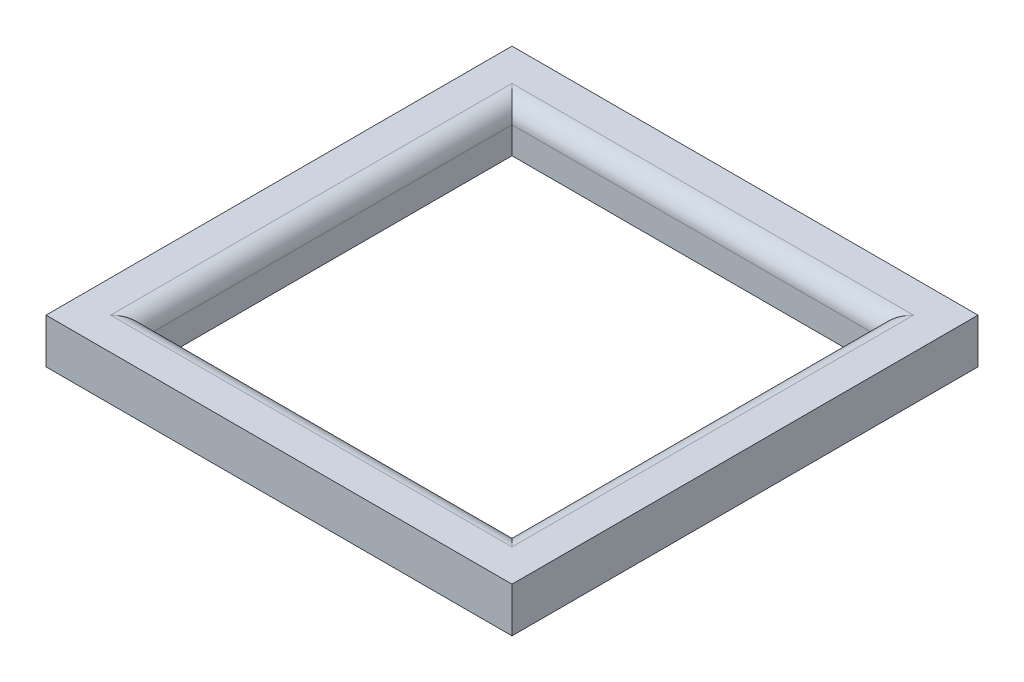
ISO-10303-21;
HEADER;
FILE_DESCRIPTION(('STEP AP214'),'2;1');
FILE_NAME('part.step','',(''),(''),'','','');
FILE_SCHEMA(('AUTOMOTIVE_DESIGN { 1 0 10303 214 1 1 1 1 }'));
ENDSEC;
DATA;
#1=APPLICATION_CONTEXT('core data for automotive mechanical design processes');
#2=APPLICATION_PROTOCOL_DEFINITION('international standard','automotive_design',2000,#1);
#3=PRODUCT_CONTEXT('',#1,'mechanical');
#4=PRODUCT('Part','Part','',(#3));
#5=PRODUCT_RELATED_PRODUCT_CATEGORY('part','',(#4));
#6=PRODUCT_DEFINITION_FORMATION('','',#4);
#7=PRODUCT_DEFINITION_CONTEXT('part definition',#1,'design');
#8=PRODUCT_DEFINITION('design','',#6,#7);
#9=PRODUCT_DEFINITION_SHAPE('','',#8);
#10=(LENGTH_UNIT() NAMED_UNIT(*) SI_UNIT(.MILLI.,.METRE.));
#11=(NAMED_UNIT(*) PLANE_ANGLE_UNIT() SI_UNIT($,.RADIAN.));
#12=(NAMED_UNIT(*) SI_UNIT($,.STERADIAN.) SOLID_ANGLE_UNIT());
#13=UNCERTAINTY_MEASURE_WITH_UNIT(LENGTH_MEASURE(1.E-05),#10,'distance_accuracy_value','');
#14=(GEOMETRIC_REPRESENTATION_CONTEXT(3) GLOBAL_UNCERTAINTY_ASSIGNED_CONTEXT((#13)) GLOBAL_UNIT_ASSIGNED_CONTEXT((#10,
#11,#12)) REPRESENTATION_CONTEXT('',''));
#15=CARTESIAN_POINT('',(0.,0.,0.));
#16=DIRECTION('',(0.,0.,1.));
#17=DIRECTION('',(1.,0.,0.));
#18=AXIS2_PLACEMENT_3D('',#15,#16,#17);
#19=CARTESIAN_POINT('',(0.,2.5,0.));
#20=DIRECTION('',(0.,1.,0.));
#21=DIRECTION('',(0.,0.,1.));
#22=AXIS2_PLACEMENT_3D('',#19,#20,#21);
#23=PLANE('',#22);
#24=DIRECTION('',(0.,0.,-1.));
#25=VECTOR('',#24,1.);
#26=CARTESIAN_POINT('',(11.2,2.5,0.));
#27=LINE('',#26,#25);
#28=CARTESIAN_POINT('',(11.2,2.5,-11.2));
#29=VERTEX_POINT('',#28);
#30=CARTESIAN_POINT('',(11.2,2.5,11.2));
#31=VERTEX_POINT('',#30);
#32=EDGE_CURVE('E176',#29,#31,#27,.F.);
#33=ORIENTED_EDGE('',*,*,#32,.T.);
#34=DIRECTION('',(1.,0.,0.));
#35=VECTOR('',#34,1.);
#36=CARTESIAN_POINT('',(0.,2.5,11.2));
#37=LINE('',#36,#35);
#38=CARTESIAN_POINT('',(-11.2,2.5,11.2));
#39=VERTEX_POINT('',#38);
#40=EDGE_CURVE('E178',#31,#39,#37,.F.);
#41=ORIENTED_EDGE('',*,*,#40,.T.);
#42=DIRECTION('',(0.,0.,1.));
#43=VECTOR('',#42,1.);
#44=CARTESIAN_POINT('',(-11.2,2.5,0.));
#45=LINE('',#44,#43);
#46=CARTESIAN_POINT('',(-11.2,2.5,-11.2));
#47=VERTEX_POINT('',#46);
#48=EDGE_CURVE('E172',#39,#47,#45,.F.);
#49=ORIENTED_EDGE('',*,*,#48,.T.);
#50=DIRECTION('',(-1.,0.,0.));
#51=VECTOR('',#50,1.);
#52=CARTESIAN_POINT('',(0.,2.5,-11.2));
#53=LINE('',#52,#51);
#54=EDGE_CURVE('E174',#47,#29,#53,.F.);
#55=ORIENTED_EDGE('',*,*,#54,.T.);
#56=EDGE_LOOP('',(#33,#41,#49,#55));
#57=FACE_BOUND('',#56,.T.);
#58=DIRECTION('',(0.,0.,-1.));
#59=VECTOR('',#58,1.);
#60=CARTESIAN_POINT('',(13.,2.5,-13.));
#61=LINE('',#60,#59);
#62=CARTESIAN_POINT('',(13.,2.5,13.));
#63=VERTEX_POINT('',#62);
#64=CARTESIAN_POINT('',(13.,2.5,-13.));
#65=VERTEX_POINT('',#64);
#66=EDGE_CURVE('E140',#63,#65,#61,.T.);
#67=ORIENTED_EDGE('',*,*,#66,.T.);
#68=DIRECTION('',(-1.,0.,0.));
#69=VECTOR('',#68,1.);
#70=CARTESIAN_POINT('',(-13.,2.5,-13.));
#71=LINE('',#70,#69);
#72=CARTESIAN_POINT('',(-13.,2.5,-13.));
#73=VERTEX_POINT('',#72);
#74=EDGE_CURVE('E143',#65,#73,#71,.T.);
#75=ORIENTED_EDGE('',*,*,#74,.T.);
#76=DIRECTION('',(0.,0.,1.));
#77=VECTOR('',#76,1.);
#78=CARTESIAN_POINT('',(-13.,2.5,-13.));
#79=LINE('',#78,#77);
#80=CARTESIAN_POINT('',(-13.,2.5,13.));
#81=VERTEX_POINT('',#80);
#82=EDGE_CURVE('E146',#73,#81,#79,.T.);
#83=ORIENTED_EDGE('',*,*,#82,.T.);
#84=DIRECTION('',(1.,0.,0.));
#85=VECTOR('',#84,1.);
#86=CARTESIAN_POINT('',(-13.,2.5,13.));
#87=LINE('',#86,#85);
#88=EDGE_CURVE('E148',#81,#63,#87,.T.);
#89=ORIENTED_EDGE('',*,*,#88,.T.);
#90=EDGE_LOOP('',(#67,#75,#83,#89));
#91=FACE_BOUND('',#90,.T.);
#92=ADVANCED_FACE('F33',(#57,#91),#23,.T.);
#93=CARTESIAN_POINT('',(0.,0.,0.));
#94=DIRECTION('',(0.,1.,0.));
#95=DIRECTION('',(0.,0.,1.));
#96=AXIS2_PLACEMENT_3D('',#93,#94,#95);
#97=PLANE('',#96);
#98=DIRECTION('',(0.,0.,-1.));
#99=VECTOR('',#98,1.);
#100=CARTESIAN_POINT('',(13.,0.,-13.));
#101=LINE('',#100,#99);
#102=CARTESIAN_POINT('',(13.,0.,13.));
#103=VERTEX_POINT('',#102);
#104=CARTESIAN_POINT('',(13.,0.,-13.));
#105=VERTEX_POINT('',#104);
#106=EDGE_CURVE('E115',#103,#105,#101,.T.);
#107=ORIENTED_EDGE('',*,*,#106,.F.);
#108=DIRECTION('',(1.,0.,0.));
#109=VECTOR('',#108,1.);
#110=CARTESIAN_POINT('',(-13.,0.,13.));
#111=LINE('',#110,#109);
#112=CARTESIAN_POINT('',(-13.,0.,13.));
#113=VERTEX_POINT('',#112);
#114=EDGE_CURVE('E144',#113,#103,#111,.T.);
#115=ORIENTED_EDGE('',*,*,#114,.F.);
#116=DIRECTION('',(0.,0.,1.));
#117=VECTOR('',#116,1.);
#118=CARTESIAN_POINT('',(-13.,0.,-13.));
#119=LINE('',#118,#117);
#120=CARTESIAN_POINT('',(-13.,0.,-13.));
#121=VERTEX_POINT('',#120);
#122=EDGE_CURVE('E155',#121,#113,#119,.T.);
#123=ORIENTED_EDGE('',*,*,#122,.F.);
#124=DIRECTION('',(-1.,0.,0.));
#125=VECTOR('',#124,1.);
#126=CARTESIAN_POINT('',(-13.,0.,-13.));
#127=LINE('',#126,#125);
#128=EDGE_CURVE('E153',#105,#121,#127,.T.);
#129=ORIENTED_EDGE('',*,*,#128,.F.);
#130=EDGE_LOOP('',(#107,#115,#123,#129));
#131=FACE_BOUND('',#130,.T.);
#132=DIRECTION('',(0.,0.,-1.));
#133=VECTOR('',#132,1.);
#134=CARTESIAN_POINT('',(10.2,0.,-10.2));
#135=LINE('',#134,#133);
#136=CARTESIAN_POINT('',(10.2,0.,10.2));
#137=VERTEX_POINT('',#136);
#138=CARTESIAN_POINT('',(10.2,0.,-10.2));
#139=VERTEX_POINT('',#138);
#140=EDGE_CURVE('E113',#137,#139,#135,.T.);
#141=ORIENTED_EDGE('',*,*,#140,.T.);
#142=DIRECTION('',(-1.,0.,0.));
#143=VECTOR('',#142,1.);
#144=CARTESIAN_POINT('',(-10.2,0.,-10.2));
#145=LINE('',#144,#143);
#146=CARTESIAN_POINT('',(-10.2,0.,-10.2));
#147=VERTEX_POINT('',#146);
#148=EDGE_CURVE('E119',#139,#147,#145,.T.);
#149=ORIENTED_EDGE('',*,*,#148,.T.);
#150=DIRECTION('',(0.,0.,1.));
#151=VECTOR('',#150,1.);
#152=CARTESIAN_POINT('',(-10.2,0.,-10.2));
#153=LINE('',#152,#151);
#154=CARTESIAN_POINT('',(-10.2,0.,10.2));
#155=VERTEX_POINT('',#154);
#156=EDGE_CURVE('E124',#147,#155,#153,.T.);
#157=ORIENTED_EDGE('',*,*,#156,.T.);
#158=DIRECTION('',(1.,0.,0.));
#159=VECTOR('',#158,1.);
#160=CARTESIAN_POINT('',(-10.2,0.,10.2));
#161=LINE('',#160,#159);
#162=EDGE_CURVE('E128',#155,#137,#161,.T.);
#163=ORIENTED_EDGE('',*,*,#162,.T.);
#164=EDGE_LOOP('',(#141,#149,#157,#163));
#165=FACE_BOUND('',#164,.T.);
#166=ADVANCED_FACE('F126',(#131,#165),#97,.F.);
#167=CARTESIAN_POINT('',(13.,2.5,-13.));
#168=DIRECTION('',(-1.,0.,0.));
#169=DIRECTION('',(0.,0.,1.));
#170=AXIS2_PLACEMENT_3D('',#167,#168,#169);
#171=PLANE('',#170);
#172=ORIENTED_EDGE('',*,*,#106,.T.);
#173=DIRECTION('',(0.,-1.,0.));
#174=VECTOR('',#173,1.);
#175=CARTESIAN_POINT('',(13.,2.5,-13.));
#176=LINE('',#175,#174);
#177=EDGE_CURVE('E166',#65,#105,#176,.T.);
#178=ORIENTED_EDGE('',*,*,#177,.F.);
#179=ORIENTED_EDGE('',*,*,#66,.F.);
#180=DIRECTION('',(0.,-1.,0.));
#181=VECTOR('',#180,1.);
#182=CARTESIAN_POINT('',(13.,2.5,13.));
#183=LINE('',#182,#181);
#184=EDGE_CURVE('E150',#63,#103,#183,.T.);
#185=ORIENTED_EDGE('',*,*,#184,.T.);
#186=EDGE_LOOP('',(#172,#178,#179,#185));
#187=FACE_BOUND('',#186,.T.);
#188=ADVANCED_FACE('F219',(#187),#171,.F.);
#189=CARTESIAN_POINT('',(-13.,2.5,-13.));
#190=DIRECTION('',(0.,0.,1.));
#191=DIRECTION('',(1.,0.,0.));
#192=AXIS2_PLACEMENT_3D('',#189,#190,#191);
#193=PLANE('',#192);
#194=ORIENTED_EDGE('',*,*,#128,.T.);
#195=DIRECTION('',(0.,-1.,0.));
#196=VECTOR('',#195,1.);
#197=CARTESIAN_POINT('',(-13.,2.5,-13.));
#198=LINE('',#197,#196);
#199=EDGE_CURVE('E163',#73,#121,#198,.T.);
#200=ORIENTED_EDGE('',*,*,#199,.F.);
#201=ORIENTED_EDGE('',*,*,#74,.F.);
#202=ORIENTED_EDGE('',*,*,#177,.T.);
#203=EDGE_LOOP('',(#194,#200,#201,#202));
#204=FACE_BOUND('',#203,.T.);
#205=ADVANCED_FACE('F222',(#204),#193,.F.);
#206=CARTESIAN_POINT('',(-13.,2.5,-13.));
#207=DIRECTION('',(1.,0.,0.));
#208=DIRECTION('',(0.,0.,-1.));
#209=AXIS2_PLACEMENT_3D('',#206,#207,#208);
#210=PLANE('',#209);
#211=ORIENTED_EDGE('',*,*,#122,.T.);
#212=DIRECTION('',(0.,-1.,0.));
#213=VECTOR('',#212,1.);
#214=CARTESIAN_POINT('',(-13.,2.5,13.));
#215=LINE('',#214,#213);
#216=EDGE_CURVE('E160',#81,#113,#215,.T.);
#217=ORIENTED_EDGE('',*,*,#216,.F.);
#218=ORIENTED_EDGE('',*,*,#82,.F.);
#219=ORIENTED_EDGE('',*,*,#199,.T.);
#220=EDGE_LOOP('',(#211,#217,#218,#219));
#221=FACE_BOUND('',#220,.T.);
#222=ADVANCED_FACE('F227',(#221),#210,.F.);
#223=CARTESIAN_POINT('',(-13.,2.5,13.));
#224=DIRECTION('',(0.,0.,-1.));
#225=DIRECTION('',(-1.,0.,0.));
#226=AXIS2_PLACEMENT_3D('',#223,#224,#225);
#227=PLANE('',#226);
#228=ORIENTED_EDGE('',*,*,#114,.T.);
#229=ORIENTED_EDGE('',*,*,#184,.F.);
#230=ORIENTED_EDGE('',*,*,#88,.F.);
#231=ORIENTED_EDGE('',*,*,#216,.T.);
#232=EDGE_LOOP('',(#228,#229,#230,#231));
#233=FACE_BOUND('',#232,.T.);
#234=ADVANCED_FACE('F230',(#233),#227,.F.);
#235=CARTESIAN_POINT('',(10.2,2.5,-10.2));
#236=DIRECTION('',(-1.,0.,0.));
#237=DIRECTION('',(0.,0.,1.));
#238=AXIS2_PLACEMENT_3D('',#235,#236,#237);
#239=PLANE('',#238);
#240=DIRECTION('',(0.,-1.,0.));
#241=VECTOR('',#240,1.);
#242=CARTESIAN_POINT('',(10.2,2.5,10.2));
#243=LINE('',#242,#241);
#244=CARTESIAN_POINT('',(10.2,1.5,10.2));
#245=VERTEX_POINT('',#244);
#246=EDGE_CURVE('E135',#245,#137,#243,.T.);
#247=ORIENTED_EDGE('',*,*,#246,.F.);
#248=DIRECTION('',(0.,0.,-1.));
#249=VECTOR('',#248,1.);
#250=CARTESIAN_POINT('',(10.2,1.5,-10.2));
#251=LINE('',#250,#249);
#252=CARTESIAN_POINT('',(10.2,1.5,-10.2));
#253=VERTEX_POINT('',#252);
#254=EDGE_CURVE('E57',#245,#253,#251,.T.);
#255=ORIENTED_EDGE('',*,*,#254,.T.);
#256=DIRECTION('',(0.,-1.,0.));
#257=VECTOR('',#256,1.);
#258=CARTESIAN_POINT('',(10.2,2.5,-10.2));
#259=LINE('',#258,#257);
#260=EDGE_CURVE('E109',#253,#139,#259,.T.);
#261=ORIENTED_EDGE('',*,*,#260,.T.);
#262=ORIENTED_EDGE('',*,*,#140,.F.);
#263=EDGE_LOOP('',(#247,#255,#261,#262));
#264=FACE_BOUND('',#263,.T.);
#265=ADVANCED_FACE('F111',(#264),#239,.T.);
#266=CARTESIAN_POINT('',(-10.2,2.5,-10.2));
#267=DIRECTION('',(0.,0.,1.));
#268=DIRECTION('',(1.,0.,0.));
#269=AXIS2_PLACEMENT_3D('',#266,#267,#268);
#270=PLANE('',#269);
#271=ORIENTED_EDGE('',*,*,#260,.F.);
#272=DIRECTION('',(-1.,0.,0.));
#273=VECTOR('',#272,1.);
#274=CARTESIAN_POINT('',(-10.2,1.5,-10.2));
#275=LINE('',#274,#273);
#276=CARTESIAN_POINT('',(-10.2,1.5,-10.2));
#277=VERTEX_POINT('',#276);
#278=EDGE_CURVE('E42',#253,#277,#275,.T.);
#279=ORIENTED_EDGE('',*,*,#278,.T.);
#280=DIRECTION('',(0.,-1.,0.));
#281=VECTOR('',#280,1.);
#282=CARTESIAN_POINT('',(-10.2,2.5,-10.2));
#283=LINE('',#282,#281);
#284=EDGE_CURVE('E116',#277,#147,#283,.T.);
#285=ORIENTED_EDGE('',*,*,#284,.T.);
#286=ORIENTED_EDGE('',*,*,#148,.F.);
#287=EDGE_LOOP('',(#271,#279,#285,#286));
#288=FACE_BOUND('',#287,.T.);
#289=ADVANCED_FACE('F120',(#288),#270,.T.);
#290=CARTESIAN_POINT('',(-10.2,2.5,-10.2));
#291=DIRECTION('',(1.,0.,0.));
#292=DIRECTION('',(0.,0.,-1.));
#293=AXIS2_PLACEMENT_3D('',#290,#291,#292);
#294=PLANE('',#293);
#295=ORIENTED_EDGE('',*,*,#284,.F.);
#296=DIRECTION('',(0.,0.,1.));
#297=VECTOR('',#296,1.);
#298=CARTESIAN_POINT('',(-10.2,1.5,-10.2));
#299=LINE('',#298,#297);
#300=CARTESIAN_POINT('',(-10.2,1.5,10.2));
#301=VERTEX_POINT('',#300);
#302=EDGE_CURVE('E11',#277,#301,#299,.T.);
#303=ORIENTED_EDGE('',*,*,#302,.T.);
#304=DIRECTION('',(0.,-1.,0.));
#305=VECTOR('',#304,1.);
#306=CARTESIAN_POINT('',(-10.2,2.5,10.2));
#307=LINE('',#306,#305);
#308=EDGE_CURVE('E137',#301,#155,#307,.T.);
#309=ORIENTED_EDGE('',*,*,#308,.T.);
#310=ORIENTED_EDGE('',*,*,#156,.F.);
#311=EDGE_LOOP('',(#295,#303,#309,#310));
#312=FACE_BOUND('',#311,.T.);
#313=ADVANCED_FACE('F203',(#312),#294,.T.);
#314=CARTESIAN_POINT('',(-10.2,2.5,10.2));
#315=DIRECTION('',(0.,0.,-1.));
#316=DIRECTION('',(-1.,0.,0.));
#317=AXIS2_PLACEMENT_3D('',#314,#315,#316);
#318=PLANE('',#317);
#319=ORIENTED_EDGE('',*,*,#308,.F.);
#320=DIRECTION('',(1.,0.,0.));
#321=VECTOR('',#320,1.);
#322=CARTESIAN_POINT('',(-10.2,1.5,10.2));
#323=LINE('',#322,#321);
#324=EDGE_CURVE('E169',#301,#245,#323,.T.);
#325=ORIENTED_EDGE('',*,*,#324,.T.);
#326=ORIENTED_EDGE('',*,*,#246,.T.);
#327=ORIENTED_EDGE('',*,*,#162,.F.);
#328=EDGE_LOOP('',(#319,#325,#326,#327));
#329=FACE_BOUND('',#328,.T.);
#330=ADVANCED_FACE('F205',(#329),#318,.T.);
#331=CARTESIAN_POINT('',(-10.2,1.5,-11.2));
#332=DIRECTION('',(-1.,0.,0.));
#333=DIRECTION('',(0.,0.,1.));
#334=AXIS2_PLACEMENT_3D('',#331,#332,#333);
#335=CYLINDRICAL_SURFACE('',#334,1.);
#336=CARTESIAN_POINT('',(11.2,1.5,-11.2));
#337=DIRECTION('',(-0.707106781186547,0.,-0.707106781186547));
#338=DIRECTION('',(0.707106781186547,0.,-0.707106781186547));
#339=AXIS2_PLACEMENT_3D('',#336,#337,#338);
#340=ELLIPSE('',#339,1.41421356237309,1.);
#341=EDGE_CURVE('E131',#29,#253,#340,.F.);
#342=ORIENTED_EDGE('',*,*,#341,.F.);
#343=ORIENTED_EDGE('',*,*,#54,.F.);
#344=CARTESIAN_POINT('',(-11.2,1.5,-11.2));
#345=DIRECTION('',(-0.707106781186547,0.,0.707106781186548));
#346=DIRECTION('',(-0.707106781186547,0.,-0.707106781186547));
#347=AXIS2_PLACEMENT_3D('',#344,#345,#346);
#348=ELLIPSE('',#347,1.4142135623731,1.);
#349=EDGE_CURVE('E37',#277,#47,#348,.T.);
#350=ORIENTED_EDGE('',*,*,#349,.F.);
#351=ORIENTED_EDGE('',*,*,#278,.F.);
#352=EDGE_LOOP('',(#342,#343,#350,#351));
#353=FACE_BOUND('',#352,.T.);
#354=ADVANCED_FACE('F35',(#353),#335,.T.);
#355=CARTESIAN_POINT('',(-11.2,1.5,-10.2));
#356=DIRECTION('',(0.,0.,1.));
#357=DIRECTION('',(1.,0.,0.));
#358=AXIS2_PLACEMENT_3D('',#355,#356,#357);
#359=CYLINDRICAL_SURFACE('',#358,1.);
#360=ORIENTED_EDGE('',*,*,#349,.T.);
#361=ORIENTED_EDGE('',*,*,#48,.F.);
#362=CARTESIAN_POINT('',(-11.2,1.5,11.2));
#363=DIRECTION('',(0.707106781186547,0.,0.707106781186547));
#364=DIRECTION('',(0.707106781186547,0.,-0.707106781186548));
#365=AXIS2_PLACEMENT_3D('',#362,#363,#364);
#366=ELLIPSE('',#365,1.41421356237309,1.);
#367=EDGE_CURVE('E185',#301,#39,#366,.T.);
#368=ORIENTED_EDGE('',*,*,#367,.F.);
#369=ORIENTED_EDGE('',*,*,#302,.F.);
#370=EDGE_LOOP('',(#360,#361,#368,#369));
#371=FACE_BOUND('',#370,.T.);
#372=ADVANCED_FACE('F199',(#371),#359,.T.);
#373=CARTESIAN_POINT('',(11.2,1.5,-10.2));
#374=DIRECTION('',(0.,0.,-1.));
#375=DIRECTION('',(-1.,0.,0.));
#376=AXIS2_PLACEMENT_3D('',#373,#374,#375);
#377=CYLINDRICAL_SURFACE('',#376,1.);
#378=ORIENTED_EDGE('',*,*,#341,.T.);
#379=ORIENTED_EDGE('',*,*,#254,.F.);
#380=CARTESIAN_POINT('',(11.2,1.5,11.2));
#381=DIRECTION('',(0.707106781186547,0.,-0.707106781186547));
#382=DIRECTION('',(0.707106781186547,0.,0.707106781186547));
#383=AXIS2_PLACEMENT_3D('',#380,#381,#382);
#384=ELLIPSE('',#383,1.41421356237309,1.);
#385=EDGE_CURVE('E183',#31,#245,#384,.F.);
#386=ORIENTED_EDGE('',*,*,#385,.F.);
#387=ORIENTED_EDGE('',*,*,#32,.F.);
#388=EDGE_LOOP('',(#378,#379,#386,#387));
#389=FACE_BOUND('',#388,.T.);
#390=ADVANCED_FACE('F190',(#389),#377,.T.);
#391=CARTESIAN_POINT('',(-10.2,1.5,11.2));
#392=DIRECTION('',(1.,0.,0.));
#393=DIRECTION('',(0.,0.,-1.));
#394=AXIS2_PLACEMENT_3D('',#391,#392,#393);
#395=CYLINDRICAL_SURFACE('',#394,1.);
#396=ORIENTED_EDGE('',*,*,#367,.T.);
#397=ORIENTED_EDGE('',*,*,#40,.F.);
#398=ORIENTED_EDGE('',*,*,#385,.T.);
#399=ORIENTED_EDGE('',*,*,#324,.F.);
#400=EDGE_LOOP('',(#396,#397,#398,#399));
#401=FACE_BOUND('',#400,.T.);
#402=ADVANCED_FACE('F207',(#401),#395,.T.);
#403=CLOSED_SHELL('',(#92,#166,#188,#205,#222,#234,#265,#289,#313,#330,#354,#372,#390,#402));
#404=MANIFOLD_SOLID_BREP('B2',#403);
#405=ADVANCED_BREP_SHAPE_REPRESENTATION('',(#18,#404),#14);
#406=SHAPE_DEFINITION_REPRESENTATION(#9,#405);
ENDSEC;
END-ISO-10303-21;
